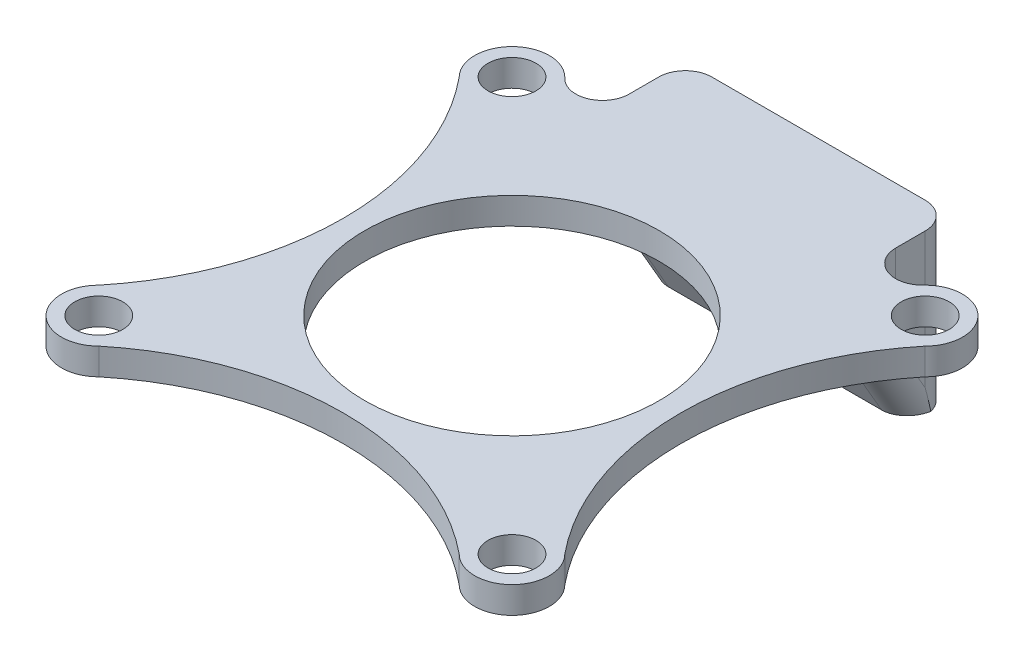
ISO-10303-21;
HEADER;
FILE_DESCRIPTION(('STEP AP214'),'2;1');
FILE_NAME('part.step','',(''),(''),'','','');
FILE_SCHEMA(('AUTOMOTIVE_DESIGN { 1 0 10303 214 1 1 1 1 }'));
ENDSEC;
DATA;
#1=APPLICATION_CONTEXT('core data for automotive mechanical design processes');
#2=APPLICATION_PROTOCOL_DEFINITION('international standard','automotive_design',2000,#1);
#3=PRODUCT_CONTEXT('',#1,'mechanical');
#4=PRODUCT('Part','Part','',(#3));
#5=PRODUCT_RELATED_PRODUCT_CATEGORY('part','',(#4));
#6=PRODUCT_DEFINITION_FORMATION('','',#4);
#7=PRODUCT_DEFINITION_CONTEXT('part definition',#1,'design');
#8=PRODUCT_DEFINITION('design','',#6,#7);
#9=PRODUCT_DEFINITION_SHAPE('','',#8);
#10=(LENGTH_UNIT() NAMED_UNIT(*) SI_UNIT(.MILLI.,.METRE.));
#11=(NAMED_UNIT(*) PLANE_ANGLE_UNIT() SI_UNIT($,.RADIAN.));
#12=(NAMED_UNIT(*) SI_UNIT($,.STERADIAN.) SOLID_ANGLE_UNIT());
#13=UNCERTAINTY_MEASURE_WITH_UNIT(LENGTH_MEASURE(1.E-05),#10,'distance_accuracy_value','');
#14=(GEOMETRIC_REPRESENTATION_CONTEXT(3) GLOBAL_UNCERTAINTY_ASSIGNED_CONTEXT((#13)) GLOBAL_UNIT_ASSIGNED_CONTEXT((#10,
#11,#12)) REPRESENTATION_CONTEXT('',''));
#15=CARTESIAN_POINT('',(0.,0.,0.));
#16=DIRECTION('',(0.,0.,1.));
#17=DIRECTION('',(1.,0.,0.));
#18=AXIS2_PLACEMENT_3D('',#15,#16,#17);
#19=CARTESIAN_POINT('',(0.,0.,0.));
#20=DIRECTION('',(0.,1.,0.));
#21=DIRECTION('',(0.,0.,1.));
#22=AXIS2_PLACEMENT_3D('',#19,#20,#21);
#23=PLANE('',#22);
#24=CARTESIAN_POINT('',(15.5,0.,-15.5));
#25=DIRECTION('',(0.,1.,0.));
#26=DIRECTION('',(0.,0.,1.));
#27=AXIS2_PLACEMENT_3D('',#24,#25,#26);
#28=CIRCLE('',#27,1.8);
#29=CARTESIAN_POINT('',(15.5,0.,-13.7));
#30=VERTEX_POINT('',#29);
#31=EDGE_CURVE('E221',#30,#30,#28,.T.);
#32=ORIENTED_EDGE('',*,*,#31,.T.);
#33=EDGE_LOOP('',(#32));
#34=FACE_BOUND('',#33,.T.);
#35=CARTESIAN_POINT('',(-15.5,0.,-15.5));
#36=DIRECTION('',(0.,1.,0.));
#37=DIRECTION('',(0.,0.,1.));
#38=AXIS2_PLACEMENT_3D('',#35,#36,#37);
#39=CIRCLE('',#38,1.8);
#40=CARTESIAN_POINT('',(-15.5,0.,-13.7));
#41=VERTEX_POINT('',#40);
#42=EDGE_CURVE('E305',#41,#41,#39,.T.);
#43=ORIENTED_EDGE('',*,*,#42,.T.);
#44=EDGE_LOOP('',(#43));
#45=FACE_BOUND('',#44,.T.);
#46=CARTESIAN_POINT('',(15.5,0.,15.5));
#47=DIRECTION('',(0.,1.,0.));
#48=DIRECTION('',(0.,0.,1.));
#49=AXIS2_PLACEMENT_3D('',#46,#47,#48);
#50=CIRCLE('',#49,1.8);
#51=CARTESIAN_POINT('',(15.5,0.,17.3));
#52=VERTEX_POINT('',#51);
#53=EDGE_CURVE('E302',#52,#52,#50,.T.);
#54=ORIENTED_EDGE('',*,*,#53,.T.);
#55=EDGE_LOOP('',(#54));
#56=FACE_BOUND('',#55,.T.);
#57=CARTESIAN_POINT('',(-15.5,0.,15.5));
#58=DIRECTION('',(0.,1.,0.));
#59=DIRECTION('',(0.,0.,1.));
#60=AXIS2_PLACEMENT_3D('',#57,#58,#59);
#61=CIRCLE('',#60,1.8);
#62=CARTESIAN_POINT('',(-15.5,0.,17.3));
#63=VERTEX_POINT('',#62);
#64=EDGE_CURVE('E299',#63,#63,#61,.T.);
#65=ORIENTED_EDGE('',*,*,#64,.T.);
#66=EDGE_LOOP('',(#65));
#67=FACE_BOUND('',#66,.T.);
#68=CARTESIAN_POINT('',(0.,0.,0.));
#69=DIRECTION('',(0.,1.,0.));
#70=DIRECTION('',(0.,0.,1.));
#71=AXIS2_PLACEMENT_3D('',#68,#69,#70);
#72=CIRCLE('',#71,11.05);
#73=CARTESIAN_POINT('',(0.,0.,11.05));
#74=VERTEX_POINT('',#73);
#75=EDGE_CURVE('E213',#74,#74,#72,.T.);
#76=ORIENTED_EDGE('',*,*,#75,.T.);
#77=EDGE_LOOP('',(#76));
#78=FACE_BOUND('',#77,.T.);
#79=DIRECTION('',(0.,0.,-1.));
#80=VECTOR('',#79,1.);
#81=CARTESIAN_POINT('',(-9.99999999999999,0.,0.));
#82=LINE('',#81,#80);
#83=CARTESIAN_POINT('',(-9.99999999999999,0.,-16.2691990514032));
#84=VERTEX_POINT('',#83);
#85=CARTESIAN_POINT('',(-9.99999999999999,0.,-18.7882250993909));
#86=VERTEX_POINT('',#85);
#87=EDGE_CURVE('E345',#84,#86,#82,.T.);
#88=ORIENTED_EDGE('',*,*,#87,.F.);
#89=CARTESIAN_POINT('',(-9.99999999999999,0.,-16.2691990514032));
#90=CARTESIAN_POINT('',(-10.0000118494146,0.,-16.1835037343897));
#91=CARTESIAN_POINT('',(-9.995871060249,0.,-16.0978584957627));
#92=CARTESIAN_POINT('',(-9.97985293954622,0.,-15.9274184610739));
#93=CARTESIAN_POINT('',(-9.96798738148554,0.,-15.8426225698818));
#94=CARTESIAN_POINT('',(-9.9372712269332,0.,-15.6753805815722));
#95=CARTESIAN_POINT('',(-9.91850649763211,0.,-15.5929184830836));
#96=CARTESIAN_POINT('',(-9.87456117093197,0.,-15.4296963884296));
#97=CARTESIAN_POINT('',(-9.84937750871959,0.,-15.3489372253551));
#98=CARTESIAN_POINT('',(-9.78275294574038,0.,-15.159829931352));
#99=CARTESIAN_POINT('',(-9.73874838783236,0.,-15.0523815928682));
#100=CARTESIAN_POINT('',(-9.64135428268142,0.,-14.8417902035389));
#101=CARTESIAN_POINT('',(-9.58795722921233,0.,-14.73865067838));
#102=CARTESIAN_POINT('',(-9.41546245238967,0.,-14.4350961040719));
#103=CARTESIAN_POINT('',(-9.28440934233648,0.,-14.241466056941));
#104=CARTESIAN_POINT('',(-8.97275976959645,0.,-13.8319811304066));
#105=CARTESIAN_POINT('',(-8.78752251951774,0.,-13.6198125874807));
#106=CARTESIAN_POINT('',(-8.4036415467613,0.,-13.2088808044606));
#107=CARTESIAN_POINT('',(-8.20500835209609,0.,-13.0101072771588));
#108=CARTESIAN_POINT('',(-8.00421636796887,0.,-12.8093138044099));
#109=CARTESIAN_POINT('',(-8.00210818282146,0.,-12.8072056192668));
#110=CARTESIAN_POINT('',(-7.99999999999999,0.,-12.8050974362655));
#111=B_SPLINE_CURVE_WITH_KNOTS('',3,(#89,#90,#91,#92,#93,#94,#95,#96,#97,#98,#99,#100,#101,#102,
#103,#104,#105,#106,#107,#108,#109,#110),.UNSPECIFIED.,.F.,.F.,(4,2,2,2,2,2,2,2,2,2,4),(0.,
0.256912595777849,0.513434539685123,0.766866291390348,1.02041927520561,1.36819331305815,
1.71624655574917,2.41527069662684,3.25887239086171,4.10181864660847,4.11076291851909),.UNSPECIFIED.);
#112=CARTESIAN_POINT('',(-7.99999999999999,0.,-12.8050974362655));
#113=VERTEX_POINT('',#112);
#114=EDGE_CURVE('E50',#84,#113,#111,.T.);
#115=ORIENTED_EDGE('',*,*,#114,.T.);
#116=DIRECTION('',(-1.,0.,0.));
#117=VECTOR('',#116,1.);
#118=CARTESIAN_POINT('',(0.,0.,-12.8050974362655));
#119=LINE('',#118,#117);
#120=CARTESIAN_POINT('',(8.00000000000001,0.,-12.8050974362655));
#121=VERTEX_POINT('',#120);
#122=EDGE_CURVE('E367',#113,#121,#119,.F.);
#123=ORIENTED_EDGE('',*,*,#122,.T.);
#124=CARTESIAN_POINT('',(10.,0.,-16.2691990514032));
#125=CARTESIAN_POINT('',(10.0000118494146,0.,-16.1835037343897));
#126=CARTESIAN_POINT('',(9.99587106024902,0.,-16.0978584957627));
#127=CARTESIAN_POINT('',(9.97985293954623,0.,-15.9274184610739));
#128=CARTESIAN_POINT('',(9.96798738148556,0.,-15.8426225698818));
#129=CARTESIAN_POINT('',(9.93727122693321,0.,-15.6753805815722));
#130=CARTESIAN_POINT('',(9.91850649763212,0.,-15.5929184830836));
#131=CARTESIAN_POINT('',(9.87456117093198,0.,-15.4296963884296));
#132=CARTESIAN_POINT('',(9.84937750871961,0.,-15.3489372253551));
#133=CARTESIAN_POINT('',(9.78275294574039,0.,-15.159829931352));
#134=CARTESIAN_POINT('',(9.73874838783237,0.,-15.0523815928682));
#135=CARTESIAN_POINT('',(9.64135428268143,0.,-14.8417902035389));
#136=CARTESIAN_POINT('',(9.58795722921235,0.,-14.73865067838));
#137=CARTESIAN_POINT('',(9.41546245238968,0.,-14.4350961040719));
#138=CARTESIAN_POINT('',(9.28440934233649,0.,-14.241466056941));
#139=CARTESIAN_POINT('',(8.97275976959646,0.,-13.8319811304066));
#140=CARTESIAN_POINT('',(8.78752251951775,0.,-13.6198125874807));
#141=CARTESIAN_POINT('',(8.40364154676131,0.,-13.2088808044606));
#142=CARTESIAN_POINT('',(8.20500835209611,0.,-13.0101072771588));
#143=CARTESIAN_POINT('',(8.00421636796889,0.,-12.8093138044099));
#144=CARTESIAN_POINT('',(8.00210818282148,0.,-12.8072056192668));
#145=CARTESIAN_POINT('',(8.00000000000001,0.,-12.8050974362655));
#146=B_SPLINE_CURVE_WITH_KNOTS('',3,(#124,#125,#126,#127,#128,#129,#130,#131,#132,#133,#134,
#135,#136,#137,#138,#139,#140,#141,#142,#143,#144,#145),.UNSPECIFIED.,.F.,.F.,(4,2,2,2,2,2,2,2,
2,2,4),(0.,0.256912595777849,0.513434539685123,0.766866291390348,1.02041927520561,
1.36819331305815,1.71624655574917,2.41527069662684,3.25887239086171,4.10181864660847,
4.11076291851909),.UNSPECIFIED.);
#147=CARTESIAN_POINT('',(10.,0.,-16.2691990514032));
#148=VERTEX_POINT('',#147);
#149=EDGE_CURVE('E11',#121,#148,#146,.F.);
#150=ORIENTED_EDGE('',*,*,#149,.T.);
#151=DIRECTION('',(0.,0.,1.));
#152=VECTOR('',#151,1.);
#153=CARTESIAN_POINT('',(10.,0.,0.));
#154=LINE('',#153,#152);
#155=CARTESIAN_POINT('',(10.,0.,-18.7882250993909));
#156=VERTEX_POINT('',#155);
#157=EDGE_CURVE('E333',#156,#148,#154,.T.);
#158=ORIENTED_EDGE('',*,*,#157,.F.);
#159=CARTESIAN_POINT('',(12.,0.,-18.7882250993909));
#160=DIRECTION('',(0.,1.,0.));
#161=DIRECTION('',(0.,0.,1.));
#162=AXIS2_PLACEMENT_3D('',#159,#160,#161);
#163=CIRCLE('',#162,2.);
#164=CARTESIAN_POINT('',(13.4142135623731,0.,-17.3740115370178));
#165=VERTEX_POINT('',#164);
#166=EDGE_CURVE('E347',#156,#165,#163,.T.);
#167=ORIENTED_EDGE('',*,*,#166,.T.);
#168=DIRECTION('',(-0.707106781186548,0.,0.707106781186548));
#169=VECTOR('',#168,1.);
#170=CARTESIAN_POINT('',(-1.97989898732233,0.,-1.97989898732233));
#171=LINE('',#170,#169);
#172=CARTESIAN_POINT('',(13.5201010126777,0.,-17.4798989873223));
#173=VERTEX_POINT('',#172);
#174=EDGE_CURVE('E285',#173,#165,#171,.T.);
#175=ORIENTED_EDGE('',*,*,#174,.F.);
#176=CARTESIAN_POINT('',(15.5,0.,-15.5));
#177=DIRECTION('',(0.,1.,0.));
#178=DIRECTION('',(0.,0.,1.));
#179=AXIS2_PLACEMENT_3D('',#176,#177,#178);
#180=CIRCLE('',#179,2.8);
#181=CARTESIAN_POINT('',(17.4798989873223,0.,-13.5201010126777));
#182=VERTEX_POINT('',#181);
#183=EDGE_CURVE('E282',#173,#182,#180,.F.);
#184=ORIENTED_EDGE('',*,*,#183,.T.);
#185=CARTESIAN_POINT('',(33.988029652564,0.,0.));
#186=DIRECTION('',(0.,1.,0.));
#187=DIRECTION('',(0.,0.,1.));
#188=AXIS2_PLACEMENT_3D('',#185,#186,#187);
#189=CIRCLE('',#188,21.338029652564);
#190=CARTESIAN_POINT('',(17.4798989873223,0.,13.5201010126777));
#191=VERTEX_POINT('',#190);
#192=EDGE_CURVE('E279',#182,#191,#189,.T.);
#193=ORIENTED_EDGE('',*,*,#192,.T.);
#194=CARTESIAN_POINT('',(15.5,0.,15.5));
#195=DIRECTION('',(0.,1.,0.));
#196=DIRECTION('',(0.,0.,1.));
#197=AXIS2_PLACEMENT_3D('',#194,#195,#196);
#198=CIRCLE('',#197,2.8);
#199=CARTESIAN_POINT('',(13.5201010126777,0.,17.4798989873223));
#200=VERTEX_POINT('',#199);
#201=EDGE_CURVE('E276',#191,#200,#198,.F.);
#202=ORIENTED_EDGE('',*,*,#201,.T.);
#203=CARTESIAN_POINT('',(0.,0.,33.9880296525639));
#204=DIRECTION('',(0.,1.,0.));
#205=DIRECTION('',(0.,0.,1.));
#206=AXIS2_PLACEMENT_3D('',#203,#204,#205);
#207=CIRCLE('',#206,21.3380296525639);
#208=CARTESIAN_POINT('',(-13.5201010126777,0.,17.4798989873223));
#209=VERTEX_POINT('',#208);
#210=EDGE_CURVE('E273',#200,#209,#207,.T.);
#211=ORIENTED_EDGE('',*,*,#210,.T.);
#212=CARTESIAN_POINT('',(-15.5,0.,15.5));
#213=DIRECTION('',(0.,1.,0.));
#214=DIRECTION('',(0.,0.,1.));
#215=AXIS2_PLACEMENT_3D('',#212,#213,#214);
#216=CIRCLE('',#215,2.8);
#217=CARTESIAN_POINT('',(-17.4798989873223,0.,13.5201010126777));
#218=VERTEX_POINT('',#217);
#219=EDGE_CURVE('E296',#218,#209,#216,.T.);
#220=ORIENTED_EDGE('',*,*,#219,.F.);
#221=CARTESIAN_POINT('',(-33.988029652564,0.,0.));
#222=DIRECTION('',(0.,1.,0.));
#223=DIRECTION('',(0.,0.,1.));
#224=AXIS2_PLACEMENT_3D('',#221,#222,#223);
#225=CIRCLE('',#224,21.338029652564);
#226=CARTESIAN_POINT('',(-17.4798989873223,0.,-13.5201010126777));
#227=VERTEX_POINT('',#226);
#228=EDGE_CURVE('E293',#227,#218,#225,.F.);
#229=ORIENTED_EDGE('',*,*,#228,.F.);
#230=CARTESIAN_POINT('',(-15.5,0.,-15.5));
#231=DIRECTION('',(0.,1.,0.));
#232=DIRECTION('',(0.,0.,1.));
#233=AXIS2_PLACEMENT_3D('',#230,#231,#232);
#234=CIRCLE('',#233,2.8);
#235=CARTESIAN_POINT('',(-13.5201010126776,0.,-17.4798989873223));
#236=VERTEX_POINT('',#235);
#237=EDGE_CURVE('E290',#236,#227,#234,.T.);
#238=ORIENTED_EDGE('',*,*,#237,.F.);
#239=DIRECTION('',(-0.707106781186547,0.,-0.707106781186548));
#240=VECTOR('',#239,1.);
#241=CARTESIAN_POINT('',(1.97989898732234,0.,-1.97989898732233));
#242=LINE('',#241,#240);
#243=CARTESIAN_POINT('',(-13.4142135623731,0.,-17.3740115370178));
#244=VERTEX_POINT('',#243);
#245=EDGE_CURVE('E288',#244,#236,#242,.T.);
#246=ORIENTED_EDGE('',*,*,#245,.F.);
#247=CARTESIAN_POINT('',(-12.,0.,-18.7882250993909));
#248=DIRECTION('',(0.,1.,0.));
#249=DIRECTION('',(0.,0.,1.));
#250=AXIS2_PLACEMENT_3D('',#247,#248,#249);
#251=CIRCLE('',#250,2.);
#252=EDGE_CURVE('E351',#244,#86,#251,.T.);
#253=ORIENTED_EDGE('',*,*,#252,.T.);
#254=EDGE_LOOP('',(#88,#115,#123,#150,#158,#167,#175,#184,#193,#202,#211,#220,#229,#238,#246,#253));
#255=FACE_BOUND('',#254,.T.);
#256=ADVANCED_FACE('F41',(#34,#45,#56,#67,#78,#255),#23,.F.);
#257=CARTESIAN_POINT('',(0.,2.,33.9880296525639));
#258=DIRECTION('',(0.,-1.,0.));
#259=DIRECTION('',(0.,0.,-1.));
#260=AXIS2_PLACEMENT_3D('',#257,#258,#259);
#261=CYLINDRICAL_SURFACE('',#260,21.3380296525639);
#262=ORIENTED_EDGE('',*,*,#210,.F.);
#263=DIRECTION('',(0.,-1.,0.));
#264=VECTOR('',#263,1.);
#265=CARTESIAN_POINT('',(13.5201010126777,2.,17.4798989873223));
#266=LINE('',#265,#264);
#267=CARTESIAN_POINT('',(13.5201010126777,2.,17.4798989873223));
#268=VERTEX_POINT('',#267);
#269=EDGE_CURVE('E331',#268,#200,#266,.T.);
#270=ORIENTED_EDGE('',*,*,#269,.F.);
#271=CARTESIAN_POINT('',(0.,2.,33.9880296525639));
#272=DIRECTION('',(0.,1.,0.));
#273=DIRECTION('',(0.,0.,1.));
#274=AXIS2_PLACEMENT_3D('',#271,#272,#273);
#275=CIRCLE('',#274,21.3380296525639);
#276=CARTESIAN_POINT('',(-13.5201010126777,2.,17.4798989873223));
#277=VERTEX_POINT('',#276);
#278=EDGE_CURVE('E220',#268,#277,#275,.T.);
#279=ORIENTED_EDGE('',*,*,#278,.T.);
#280=DIRECTION('',(0.,-1.,0.));
#281=VECTOR('',#280,1.);
#282=CARTESIAN_POINT('',(-13.5201010126777,2.,17.4798989873223));
#283=LINE('',#282,#281);
#284=EDGE_CURVE('E270',#277,#209,#283,.T.);
#285=ORIENTED_EDGE('',*,*,#284,.T.);
#286=EDGE_LOOP('',(#262,#270,#279,#285));
#287=FACE_BOUND('',#286,.T.);
#288=ADVANCED_FACE('F422',(#287),#261,.F.);
#289=CARTESIAN_POINT('',(15.5,2.,15.5));
#290=DIRECTION('',(0.,-1.,0.));
#291=DIRECTION('',(0.,0.,-1.));
#292=AXIS2_PLACEMENT_3D('',#289,#290,#291);
#293=CYLINDRICAL_SURFACE('',#292,2.8);
#294=ORIENTED_EDGE('',*,*,#201,.F.);
#295=DIRECTION('',(0.,-1.,0.));
#296=VECTOR('',#295,1.);
#297=CARTESIAN_POINT('',(17.4798989873223,2.,13.5201010126777));
#298=LINE('',#297,#296);
#299=CARTESIAN_POINT('',(17.4798989873223,2.,13.5201010126777));
#300=VERTEX_POINT('',#299);
#301=EDGE_CURVE('E329',#300,#191,#298,.T.);
#302=ORIENTED_EDGE('',*,*,#301,.F.);
#303=CARTESIAN_POINT('',(15.5,2.,15.5));
#304=DIRECTION('',(0.,1.,0.));
#305=DIRECTION('',(0.,0.,1.));
#306=AXIS2_PLACEMENT_3D('',#303,#304,#305);
#307=CIRCLE('',#306,2.8);
#308=EDGE_CURVE('E224',#300,#268,#307,.F.);
#309=ORIENTED_EDGE('',*,*,#308,.T.);
#310=ORIENTED_EDGE('',*,*,#269,.T.);
#311=EDGE_LOOP('',(#294,#302,#309,#310));
#312=FACE_BOUND('',#311,.T.);
#313=ADVANCED_FACE('F427',(#312),#293,.T.);
#314=CARTESIAN_POINT('',(33.988029652564,2.,0.));
#315=DIRECTION('',(0.,-1.,0.));
#316=DIRECTION('',(0.,0.,-1.));
#317=AXIS2_PLACEMENT_3D('',#314,#315,#316);
#318=CYLINDRICAL_SURFACE('',#317,21.338029652564);
#319=ORIENTED_EDGE('',*,*,#192,.F.);
#320=DIRECTION('',(0.,-1.,0.));
#321=VECTOR('',#320,1.);
#322=CARTESIAN_POINT('',(17.4798989873223,2.,-13.5201010126777));
#323=LINE('',#322,#321);
#324=CARTESIAN_POINT('',(17.4798989873223,2.,-13.5201010126777));
#325=VERTEX_POINT('',#324);
#326=EDGE_CURVE('E327',#325,#182,#323,.T.);
#327=ORIENTED_EDGE('',*,*,#326,.F.);
#328=CARTESIAN_POINT('',(33.988029652564,2.,0.));
#329=DIRECTION('',(0.,1.,0.));
#330=DIRECTION('',(0.,0.,1.));
#331=AXIS2_PLACEMENT_3D('',#328,#329,#330);
#332=CIRCLE('',#331,21.338029652564);
#333=EDGE_CURVE('E227',#325,#300,#332,.T.);
#334=ORIENTED_EDGE('',*,*,#333,.T.);
#335=ORIENTED_EDGE('',*,*,#301,.T.);
#336=EDGE_LOOP('',(#319,#327,#334,#335));
#337=FACE_BOUND('',#336,.T.);
#338=ADVANCED_FACE('F491',(#337),#318,.F.);
#339=CARTESIAN_POINT('',(15.5,2.,-15.5));
#340=DIRECTION('',(0.,-1.,0.));
#341=DIRECTION('',(0.,0.,-1.));
#342=AXIS2_PLACEMENT_3D('',#339,#340,#341);
#343=CYLINDRICAL_SURFACE('',#342,2.8);
#344=ORIENTED_EDGE('',*,*,#183,.F.);
#345=DIRECTION('',(0.,-1.,0.));
#346=VECTOR('',#345,1.);
#347=CARTESIAN_POINT('',(13.5201010126777,2.,-17.4798989873223));
#348=LINE('',#347,#346);
#349=CARTESIAN_POINT('',(13.5201010126777,2.,-17.4798989873223));
#350=VERTEX_POINT('',#349);
#351=EDGE_CURVE('E325',#350,#173,#348,.T.);
#352=ORIENTED_EDGE('',*,*,#351,.F.);
#353=CARTESIAN_POINT('',(15.5,2.,-15.5));
#354=DIRECTION('',(0.,1.,0.));
#355=DIRECTION('',(0.,0.,1.));
#356=AXIS2_PLACEMENT_3D('',#353,#354,#355);
#357=CIRCLE('',#356,2.8);
#358=EDGE_CURVE('E230',#350,#325,#357,.F.);
#359=ORIENTED_EDGE('',*,*,#358,.T.);
#360=ORIENTED_EDGE('',*,*,#326,.T.);
#361=EDGE_LOOP('',(#344,#352,#359,#360));
#362=FACE_BOUND('',#361,.T.);
#363=ADVANCED_FACE('F487',(#362),#343,.T.);
#364=CARTESIAN_POINT('',(-1.97989898732233,2.,-1.97989898732233));
#365=DIRECTION('',(0.707106781186547,0.,0.707106781186547));
#366=DIRECTION('',(0.707106781186548,0.,-0.707106781186548));
#367=AXIS2_PLACEMENT_3D('',#364,#365,#366);
#368=PLANE('',#367);
#369=ORIENTED_EDGE('',*,*,#174,.T.);
#370=DIRECTION('',(0.,-1.,0.));
#371=VECTOR('',#370,1.);
#372=CARTESIAN_POINT('',(13.4142135623731,2.,-17.3740115370178));
#373=LINE('',#372,#371);
#374=CARTESIAN_POINT('',(13.4142135623731,2.,-17.3740115370178));
#375=VERTEX_POINT('',#374);
#376=EDGE_CURVE('E338',#165,#375,#373,.F.);
#377=ORIENTED_EDGE('',*,*,#376,.T.);
#378=DIRECTION('',(-0.707106781186548,0.,0.707106781186548));
#379=VECTOR('',#378,1.);
#380=CARTESIAN_POINT('',(-1.97989898732233,2.,-1.97989898732233));
#381=LINE('',#380,#379);
#382=EDGE_CURVE('E233',#350,#375,#381,.T.);
#383=ORIENTED_EDGE('',*,*,#382,.F.);
#384=ORIENTED_EDGE('',*,*,#351,.T.);
#385=EDGE_LOOP('',(#369,#377,#383,#384));
#386=FACE_BOUND('',#385,.T.);
#387=ADVANCED_FACE('F483',(#386),#368,.F.);
#388=CARTESIAN_POINT('',(10.,2.,0.));
#389=DIRECTION('',(1.,0.,0.));
#390=DIRECTION('',(0.,0.,-1.));
#391=AXIS2_PLACEMENT_3D('',#388,#389,#390);
#392=PLANE('',#391);
#393=ORIENTED_EDGE('',*,*,#157,.T.);
#394=DIRECTION('',(0.,-0.86602540378444,-0.499999999999998));
#395=VECTOR('',#394,1.);
#396=CARTESIAN_POINT('',(10.,8.54476983887042,-11.335873884768));
#397=LINE('',#396,#395);
#398=CARTESIAN_POINT('',(10.,-8.19398760346472,-21.));
#399=VERTEX_POINT('',#398);
#400=EDGE_CURVE('E58',#148,#399,#397,.T.);
#401=ORIENTED_EDGE('',*,*,#400,.T.);
#402=DIRECTION('',(0.,-1.,0.));
#403=VECTOR('',#402,1.);
#404=CARTESIAN_POINT('',(10.,2.,-21.));
#405=LINE('',#404,#403);
#406=CARTESIAN_POINT('',(10.,2.,-21.));
#407=VERTEX_POINT('',#406);
#408=EDGE_CURVE('E323',#407,#399,#405,.T.);
#409=ORIENTED_EDGE('',*,*,#408,.F.);
#410=DIRECTION('',(0.,0.,1.));
#411=VECTOR('',#410,1.);
#412=CARTESIAN_POINT('',(10.,2.,0.));
#413=LINE('',#412,#411);
#414=CARTESIAN_POINT('',(10.,2.,-18.7882250993909));
#415=VERTEX_POINT('',#414);
#416=EDGE_CURVE('E236',#407,#415,#413,.T.);
#417=ORIENTED_EDGE('',*,*,#416,.T.);
#418=DIRECTION('',(0.,-1.,0.));
#419=VECTOR('',#418,1.);
#420=CARTESIAN_POINT('',(10.,2.,-18.7882250993909));
#421=LINE('',#420,#419);
#422=EDGE_CURVE('E335',#415,#156,#421,.T.);
#423=ORIENTED_EDGE('',*,*,#422,.T.);
#424=EDGE_LOOP('',(#393,#401,#409,#417,#423));
#425=FACE_BOUND('',#424,.T.);
#426=ADVANCED_FACE('F476',(#425),#392,.T.);
#427=CARTESIAN_POINT('',(8.00000000000001,2.,-21.));
#428=DIRECTION('',(0.,-1.,0.));
#429=DIRECTION('',(0.,0.,-1.));
#430=AXIS2_PLACEMENT_3D('',#427,#428,#429);
#431=CYLINDRICAL_SURFACE('',#430,2.);
#432=ORIENTED_EDGE('',*,*,#408,.T.);
#433=CARTESIAN_POINT('',(8.00000000000001,-8.19398760346472,-21.));
#434=DIRECTION('',(0.,-0.25881904510252,0.965925826289069));
#435=DIRECTION('',(0.,-0.965925826289069,-0.25881904510252));
#436=AXIS2_PLACEMENT_3D('',#433,#434,#435);
#437=ELLIPSE('',#436,7.72740661031259,2.);
#438=CARTESIAN_POINT('',(9.94057255890607,-10.,-21.4839195631722));
#439=VERTEX_POINT('',#438);
#440=EDGE_CURVE('E387',#399,#439,#437,.F.);
#441=ORIENTED_EDGE('',*,*,#440,.T.);
#442=CARTESIAN_POINT('',(8.00000000000001,-10.,-21.));
#443=DIRECTION('',(0.,-1.,0.));
#444=DIRECTION('',(0.,0.,-1.));
#445=AXIS2_PLACEMENT_3D('',#442,#443,#444);
#446=CIRCLE('',#445,2.);
#447=CARTESIAN_POINT('',(8.00000000000001,-10.,-23.));
#448=VERTEX_POINT('',#447);
#449=EDGE_CURVE('E211',#448,#439,#446,.T.);
#450=ORIENTED_EDGE('',*,*,#449,.F.);
#451=DIRECTION('',(0.,-1.,0.));
#452=VECTOR('',#451,1.);
#453=CARTESIAN_POINT('',(8.00000000000001,2.,-23.));
#454=LINE('',#453,#452);
#455=CARTESIAN_POINT('',(8.00000000000001,2.,-23.));
#456=VERTEX_POINT('',#455);
#457=EDGE_CURVE('E207',#456,#448,#454,.T.);
#458=ORIENTED_EDGE('',*,*,#457,.F.);
#459=CARTESIAN_POINT('',(8.00000000000001,2.,-21.));
#460=DIRECTION('',(0.,1.,0.));
#461=DIRECTION('',(0.,0.,1.));
#462=AXIS2_PLACEMENT_3D('',#459,#460,#461);
#463=CIRCLE('',#462,2.);
#464=EDGE_CURVE('E239',#456,#407,#463,.F.);
#465=ORIENTED_EDGE('',*,*,#464,.T.);
#466=EDGE_LOOP('',(#432,#441,#450,#458,#465));
#467=FACE_BOUND('',#466,.T.);
#468=ADVANCED_FACE('F464',(#467),#431,.T.);
#469=CARTESIAN_POINT('',(0.,2.,-23.));
#470=DIRECTION('',(0.,0.,-1.));
#471=DIRECTION('',(-1.,0.,0.));
#472=AXIS2_PLACEMENT_3D('',#469,#470,#471);
#473=PLANE('',#472);
#474=CARTESIAN_POINT('',(-4.75,-5.,-23.));
#475=DIRECTION('',(0.,0.,-1.));
#476=DIRECTION('',(-1.,0.,0.));
#477=AXIS2_PLACEMENT_3D('',#474,#475,#476);
#478=CIRCLE('',#477,0.75);
#479=CARTESIAN_POINT('',(-5.5,-5.,-23.));
#480=VERTEX_POINT('',#479);
#481=EDGE_CURVE('E364',#480,#480,#478,.T.);
#482=ORIENTED_EDGE('',*,*,#481,.F.);
#483=EDGE_LOOP('',(#482));
#484=FACE_BOUND('',#483,.T.);
#485=CARTESIAN_POINT('',(4.75,-5.,-23.));
#486=DIRECTION('',(0.,0.,-1.));
#487=DIRECTION('',(-1.,0.,0.));
#488=AXIS2_PLACEMENT_3D('',#485,#486,#487);
#489=CIRCLE('',#488,0.75);
#490=CARTESIAN_POINT('',(4.,-5.,-23.));
#491=VERTEX_POINT('',#490);
#492=EDGE_CURVE('E450',#491,#491,#489,.T.);
#493=ORIENTED_EDGE('',*,*,#492,.F.);
#494=EDGE_LOOP('',(#493));
#495=FACE_BOUND('',#494,.T.);
#496=ORIENTED_EDGE('',*,*,#457,.T.);
#497=DIRECTION('',(1.,0.,0.));
#498=VECTOR('',#497,1.);
#499=CARTESIAN_POINT('',(0.,-10.,-23.));
#500=LINE('',#499,#498);
#501=CARTESIAN_POINT('',(-7.99999999999999,-10.,-23.));
#502=VERTEX_POINT('',#501);
#503=EDGE_CURVE('E191',#502,#448,#500,.T.);
#504=ORIENTED_EDGE('',*,*,#503,.F.);
#505=DIRECTION('',(0.,-1.,0.));
#506=VECTOR('',#505,1.);
#507=CARTESIAN_POINT('',(-7.99999999999999,2.,-23.));
#508=LINE('',#507,#506);
#509=CARTESIAN_POINT('',(-7.99999999999999,2.,-23.));
#510=VERTEX_POINT('',#509);
#511=EDGE_CURVE('E200',#510,#502,#508,.T.);
#512=ORIENTED_EDGE('',*,*,#511,.F.);
#513=DIRECTION('',(1.,0.,0.));
#514=VECTOR('',#513,1.);
#515=CARTESIAN_POINT('',(0.,2.,-23.));
#516=LINE('',#515,#514);
#517=EDGE_CURVE('E242',#510,#456,#516,.T.);
#518=ORIENTED_EDGE('',*,*,#517,.T.);
#519=EDGE_LOOP('',(#496,#504,#512,#518));
#520=FACE_BOUND('',#519,.T.);
#521=ADVANCED_FACE('F210',(#484,#495,#520),#473,.T.);
#522=CARTESIAN_POINT('',(-7.99999999999999,2.,-21.));
#523=DIRECTION('',(0.,-1.,0.));
#524=DIRECTION('',(0.,0.,-1.));
#525=AXIS2_PLACEMENT_3D('',#522,#523,#524);
#526=CYLINDRICAL_SURFACE('',#525,2.);
#527=CARTESIAN_POINT('',(-7.99999999999999,-10.,-21.));
#528=DIRECTION('',(0.,-1.,0.));
#529=DIRECTION('',(0.,0.,-1.));
#530=AXIS2_PLACEMENT_3D('',#527,#528,#529);
#531=CIRCLE('',#530,2.);
#532=CARTESIAN_POINT('',(-9.94057255890605,-10.,-21.4839195631722));
#533=VERTEX_POINT('',#532);
#534=EDGE_CURVE('E185',#533,#502,#531,.T.);
#535=ORIENTED_EDGE('',*,*,#534,.F.);
#536=CARTESIAN_POINT('',(-7.99999999999999,-8.19398760346472,-21.));
#537=DIRECTION('',(0.,-0.25881904510252,0.965925826289069));
#538=DIRECTION('',(0.,-0.965925826289069,-0.25881904510252));
#539=AXIS2_PLACEMENT_3D('',#536,#537,#538);
#540=ELLIPSE('',#539,7.72740661031259,2.);
#541=CARTESIAN_POINT('',(-9.99999999999999,-8.19398760346472,-21.));
#542=VERTEX_POINT('',#541);
#543=EDGE_CURVE('E384',#533,#542,#540,.F.);
#544=ORIENTED_EDGE('',*,*,#543,.T.);
#545=DIRECTION('',(0.,-1.,0.));
#546=VECTOR('',#545,1.);
#547=CARTESIAN_POINT('',(-9.99999999999999,2.,-21.));
#548=LINE('',#547,#546);
#549=CARTESIAN_POINT('',(-9.99999999999999,2.,-21.));
#550=VERTEX_POINT('',#549);
#551=EDGE_CURVE('E208',#550,#542,#548,.T.);
#552=ORIENTED_EDGE('',*,*,#551,.F.);
#553=CARTESIAN_POINT('',(-7.99999999999999,2.,-21.));
#554=DIRECTION('',(0.,1.,0.));
#555=DIRECTION('',(0.,0.,1.));
#556=AXIS2_PLACEMENT_3D('',#553,#554,#555);
#557=CIRCLE('',#556,2.);
#558=EDGE_CURVE('E203',#550,#510,#557,.F.);
#559=ORIENTED_EDGE('',*,*,#558,.T.);
#560=ORIENTED_EDGE('',*,*,#511,.T.);
#561=EDGE_LOOP('',(#535,#544,#552,#559,#560));
#562=FACE_BOUND('',#561,.T.);
#563=ADVANCED_FACE('F201',(#562),#526,.T.);
#564=CARTESIAN_POINT('',(-9.99999999999999,2.,0.));
#565=DIRECTION('',(1.,0.,0.));
#566=DIRECTION('',(0.,0.,-1.));
#567=AXIS2_PLACEMENT_3D('',#564,#565,#566);
#568=PLANE('',#567);
#569=ORIENTED_EDGE('',*,*,#551,.T.);
#570=DIRECTION('',(0.,0.86602540378444,0.499999999999998));
#571=VECTOR('',#570,1.);
#572=CARTESIAN_POINT('',(-9.99999999999999,0.,-16.2691990514032));
#573=LINE('',#572,#571);
#574=EDGE_CURVE('E375',#542,#84,#573,.T.);
#575=ORIENTED_EDGE('',*,*,#574,.T.);
#576=ORIENTED_EDGE('',*,*,#87,.T.);
#577=DIRECTION('',(0.,-1.,0.));
#578=VECTOR('',#577,1.);
#579=CARTESIAN_POINT('',(-9.99999999999999,2.,-18.7882250993909));
#580=LINE('',#579,#578);
#581=CARTESIAN_POINT('',(-9.99999999999999,2.,-18.7882250993909));
#582=VERTEX_POINT('',#581);
#583=EDGE_CURVE('E343',#86,#582,#580,.F.);
#584=ORIENTED_EDGE('',*,*,#583,.T.);
#585=DIRECTION('',(0.,0.,1.));
#586=VECTOR('',#585,1.);
#587=CARTESIAN_POINT('',(-9.99999999999999,2.,0.));
#588=LINE('',#587,#586);
#589=EDGE_CURVE('E245',#550,#582,#588,.T.);
#590=ORIENTED_EDGE('',*,*,#589,.F.);
#591=EDGE_LOOP('',(#569,#575,#576,#584,#590));
#592=FACE_BOUND('',#591,.T.);
#593=ADVANCED_FACE('F466',(#592),#568,.F.);
#594=CARTESIAN_POINT('',(1.97989898732234,2.,-1.97989898732233));
#595=DIRECTION('',(-0.707106781186548,0.,0.707106781186547));
#596=DIRECTION('',(0.707106781186547,0.,0.707106781186548));
#597=AXIS2_PLACEMENT_3D('',#594,#595,#596);
#598=PLANE('',#597);
#599=DIRECTION('',(-0.707106781186547,0.,-0.707106781186548));
#600=VECTOR('',#599,1.);
#601=CARTESIAN_POINT('',(1.97989898732234,2.,-1.97989898732233));
#602=LINE('',#601,#600);
#603=CARTESIAN_POINT('',(-13.4142135623731,2.,-17.3740115370178));
#604=VERTEX_POINT('',#603);
#605=CARTESIAN_POINT('',(-13.5201010126776,2.,-17.4798989873223));
#606=VERTEX_POINT('',#605);
#607=EDGE_CURVE('E248',#604,#606,#602,.T.);
#608=ORIENTED_EDGE('',*,*,#607,.F.);
#609=DIRECTION('',(0.,-1.,0.));
#610=VECTOR('',#609,1.);
#611=CARTESIAN_POINT('',(-13.4142135623731,0.,-17.3740115370178));
#612=LINE('',#611,#610);
#613=EDGE_CURVE('E340',#604,#244,#612,.T.);
#614=ORIENTED_EDGE('',*,*,#613,.T.);
#615=ORIENTED_EDGE('',*,*,#245,.T.);
#616=DIRECTION('',(0.,-1.,0.));
#617=VECTOR('',#616,1.);
#618=CARTESIAN_POINT('',(-13.5201010126776,2.,-17.4798989873223));
#619=LINE('',#618,#617);
#620=EDGE_CURVE('E317',#606,#236,#619,.T.);
#621=ORIENTED_EDGE('',*,*,#620,.F.);
#622=EDGE_LOOP('',(#608,#614,#615,#621));
#623=FACE_BOUND('',#622,.T.);
#624=ADVANCED_FACE('F510',(#623),#598,.F.);
#625=CARTESIAN_POINT('',(-15.5,2.,-15.5));
#626=DIRECTION('',(0.,-1.,0.));
#627=DIRECTION('',(0.,0.,-1.));
#628=AXIS2_PLACEMENT_3D('',#625,#626,#627);
#629=CYLINDRICAL_SURFACE('',#628,2.8);
#630=ORIENTED_EDGE('',*,*,#237,.T.);
#631=DIRECTION('',(0.,-1.,0.));
#632=VECTOR('',#631,1.);
#633=CARTESIAN_POINT('',(-17.4798989873223,2.,-13.5201010126777));
#634=LINE('',#633,#632);
#635=CARTESIAN_POINT('',(-17.4798989873223,2.,-13.5201010126777));
#636=VERTEX_POINT('',#635);
#637=EDGE_CURVE('E314',#636,#227,#634,.T.);
#638=ORIENTED_EDGE('',*,*,#637,.F.);
#639=CARTESIAN_POINT('',(-15.5,2.,-15.5));
#640=DIRECTION('',(0.,1.,0.));
#641=DIRECTION('',(0.,0.,1.));
#642=AXIS2_PLACEMENT_3D('',#639,#640,#641);
#643=CIRCLE('',#642,2.8);
#644=EDGE_CURVE('E250',#606,#636,#643,.T.);
#645=ORIENTED_EDGE('',*,*,#644,.F.);
#646=ORIENTED_EDGE('',*,*,#620,.T.);
#647=EDGE_LOOP('',(#630,#638,#645,#646));
#648=FACE_BOUND('',#647,.T.);
#649=ADVANCED_FACE('F506',(#648),#629,.T.);
#650=CARTESIAN_POINT('',(-33.988029652564,2.,0.));
#651=DIRECTION('',(0.,-1.,0.));
#652=DIRECTION('',(0.,0.,-1.));
#653=AXIS2_PLACEMENT_3D('',#650,#651,#652);
#654=CYLINDRICAL_SURFACE('',#653,21.338029652564);
#655=ORIENTED_EDGE('',*,*,#228,.T.);
#656=DIRECTION('',(0.,-1.,0.));
#657=VECTOR('',#656,1.);
#658=CARTESIAN_POINT('',(-17.4798989873223,2.,13.5201010126777));
#659=LINE('',#658,#657);
#660=CARTESIAN_POINT('',(-17.4798989873223,2.,13.5201010126777));
#661=VERTEX_POINT('',#660);
#662=EDGE_CURVE('E311',#661,#218,#659,.T.);
#663=ORIENTED_EDGE('',*,*,#662,.F.);
#664=CARTESIAN_POINT('',(-33.988029652564,2.,0.));
#665=DIRECTION('',(0.,1.,0.));
#666=DIRECTION('',(0.,0.,1.));
#667=AXIS2_PLACEMENT_3D('',#664,#665,#666);
#668=CIRCLE('',#667,21.338029652564);
#669=EDGE_CURVE('E253',#636,#661,#668,.F.);
#670=ORIENTED_EDGE('',*,*,#669,.F.);
#671=ORIENTED_EDGE('',*,*,#637,.T.);
#672=EDGE_LOOP('',(#655,#663,#670,#671));
#673=FACE_BOUND('',#672,.T.);
#674=ADVANCED_FACE('F502',(#673),#654,.F.);
#675=CARTESIAN_POINT('',(-15.5,2.,-15.5));
#676=DIRECTION('',(0.,-1.,0.));
#677=DIRECTION('',(0.,0.,-1.));
#678=AXIS2_PLACEMENT_3D('',#675,#676,#677);
#679=CYLINDRICAL_SURFACE('',#678,1.8);
#680=CARTESIAN_POINT('',(-15.5,2.,-15.5));
#681=DIRECTION('',(0.,1.,0.));
#682=DIRECTION('',(0.,0.,1.));
#683=AXIS2_PLACEMENT_3D('',#680,#681,#682);
#684=CIRCLE('',#683,1.8);
#685=CARTESIAN_POINT('',(-15.5,2.,-13.7));
#686=VERTEX_POINT('',#685);
#687=EDGE_CURVE('E264',#686,#686,#684,.T.);
#688=ORIENTED_EDGE('',*,*,#687,.T.);
#689=EDGE_LOOP('',(#688));
#690=FACE_BOUND('',#689,.T.);
#691=ORIENTED_EDGE('',*,*,#42,.F.);
#692=EDGE_LOOP('',(#691));
#693=FACE_BOUND('',#692,.T.);
#694=ADVANCED_FACE('F556',(#690,#693),#679,.F.);
#695=CARTESIAN_POINT('',(15.5,2.,15.5));
#696=DIRECTION('',(0.,-1.,0.));
#697=DIRECTION('',(0.,0.,-1.));
#698=AXIS2_PLACEMENT_3D('',#695,#696,#697);
#699=CYLINDRICAL_SURFACE('',#698,1.8);
#700=CARTESIAN_POINT('',(15.5,2.,15.5));
#701=DIRECTION('',(0.,1.,0.));
#702=DIRECTION('',(0.,0.,1.));
#703=AXIS2_PLACEMENT_3D('',#700,#701,#702);
#704=CIRCLE('',#703,1.8);
#705=CARTESIAN_POINT('',(15.5,2.,17.3));
#706=VERTEX_POINT('',#705);
#707=EDGE_CURVE('E261',#706,#706,#704,.T.);
#708=ORIENTED_EDGE('',*,*,#707,.T.);
#709=EDGE_LOOP('',(#708));
#710=FACE_BOUND('',#709,.T.);
#711=ORIENTED_EDGE('',*,*,#53,.F.);
#712=EDGE_LOOP('',(#711));
#713=FACE_BOUND('',#712,.T.);
#714=ADVANCED_FACE('F562',(#710,#713),#699,.F.);
#715=CARTESIAN_POINT('',(-15.5,2.,15.5));
#716=DIRECTION('',(0.,-1.,0.));
#717=DIRECTION('',(0.,0.,-1.));
#718=AXIS2_PLACEMENT_3D('',#715,#716,#717);
#719=CYLINDRICAL_SURFACE('',#718,1.8);
#720=CARTESIAN_POINT('',(-15.5,2.,15.5));
#721=DIRECTION('',(0.,1.,0.));
#722=DIRECTION('',(0.,0.,1.));
#723=AXIS2_PLACEMENT_3D('',#720,#721,#722);
#724=CIRCLE('',#723,1.8);
#725=CARTESIAN_POINT('',(-15.5,2.,17.3));
#726=VERTEX_POINT('',#725);
#727=EDGE_CURVE('E258',#726,#726,#724,.T.);
#728=ORIENTED_EDGE('',*,*,#727,.T.);
#729=EDGE_LOOP('',(#728));
#730=FACE_BOUND('',#729,.T.);
#731=ORIENTED_EDGE('',*,*,#64,.F.);
#732=EDGE_LOOP('',(#731));
#733=FACE_BOUND('',#732,.T.);
#734=ADVANCED_FACE('F559',(#730,#733),#719,.F.);
#735=CARTESIAN_POINT('',(-15.5,2.,15.5));
#736=DIRECTION('',(0.,-1.,0.));
#737=DIRECTION('',(0.,0.,-1.));
#738=AXIS2_PLACEMENT_3D('',#735,#736,#737);
#739=CYLINDRICAL_SURFACE('',#738,2.8);
#740=ORIENTED_EDGE('',*,*,#219,.T.);
#741=ORIENTED_EDGE('',*,*,#284,.F.);
#742=CARTESIAN_POINT('',(-15.5,2.,15.5));
#743=DIRECTION('',(0.,1.,0.));
#744=DIRECTION('',(0.,0.,1.));
#745=AXIS2_PLACEMENT_3D('',#742,#743,#744);
#746=CIRCLE('',#745,2.8);
#747=EDGE_CURVE('E256',#661,#277,#746,.T.);
#748=ORIENTED_EDGE('',*,*,#747,.F.);
#749=ORIENTED_EDGE('',*,*,#662,.T.);
#750=EDGE_LOOP('',(#740,#741,#748,#749));
#751=FACE_BOUND('',#750,.T.);
#752=ADVANCED_FACE('F500',(#751),#739,.T.);
#753=CARTESIAN_POINT('',(0.,2.,0.));
#754=DIRECTION('',(0.,-1.,0.));
#755=DIRECTION('',(0.,0.,-1.));
#756=AXIS2_PLACEMENT_3D('',#753,#754,#755);
#757=CYLINDRICAL_SURFACE('',#756,11.05);
#758=CARTESIAN_POINT('',(0.,2.,0.));
#759=DIRECTION('',(0.,1.,0.));
#760=DIRECTION('',(0.,0.,1.));
#761=AXIS2_PLACEMENT_3D('',#758,#759,#760);
#762=CIRCLE('',#761,11.05);
#763=CARTESIAN_POINT('',(0.,2.,11.05));
#764=VERTEX_POINT('',#763);
#765=EDGE_CURVE('E217',#764,#764,#762,.T.);
#766=ORIENTED_EDGE('',*,*,#765,.T.);
#767=EDGE_LOOP('',(#766));
#768=FACE_BOUND('',#767,.T.);
#769=ORIENTED_EDGE('',*,*,#75,.F.);
#770=EDGE_LOOP('',(#769));
#771=FACE_BOUND('',#770,.T.);
#772=ADVANCED_FACE('F526',(#768,#771),#757,.F.);
#773=CARTESIAN_POINT('',(15.5,2.,-15.5));
#774=DIRECTION('',(0.,-1.,0.));
#775=DIRECTION('',(0.,0.,-1.));
#776=AXIS2_PLACEMENT_3D('',#773,#774,#775);
#777=CYLINDRICAL_SURFACE('',#776,1.8);
#778=CARTESIAN_POINT('',(15.5,2.,-15.5));
#779=DIRECTION('',(0.,1.,0.));
#780=DIRECTION('',(0.,0.,1.));
#781=AXIS2_PLACEMENT_3D('',#778,#779,#780);
#782=CIRCLE('',#781,1.8);
#783=CARTESIAN_POINT('',(15.5,2.,-13.7));
#784=VERTEX_POINT('',#783);
#785=EDGE_CURVE('E267',#784,#784,#782,.T.);
#786=ORIENTED_EDGE('',*,*,#785,.T.);
#787=EDGE_LOOP('',(#786));
#788=FACE_BOUND('',#787,.T.);
#789=ORIENTED_EDGE('',*,*,#31,.F.);
#790=EDGE_LOOP('',(#789));
#791=FACE_BOUND('',#790,.T.);
#792=ADVANCED_FACE('F528',(#788,#791),#777,.F.);
#793=CARTESIAN_POINT('',(0.,2.,0.));
#794=DIRECTION('',(0.,1.,0.));
#795=DIRECTION('',(0.,0.,1.));
#796=AXIS2_PLACEMENT_3D('',#793,#794,#795);
#797=PLANE('',#796);
#798=ORIENTED_EDGE('',*,*,#765,.F.);
#799=EDGE_LOOP('',(#798));
#800=FACE_BOUND('',#799,.T.);
#801=ORIENTED_EDGE('',*,*,#278,.F.);
#802=ORIENTED_EDGE('',*,*,#308,.F.);
#803=ORIENTED_EDGE('',*,*,#333,.F.);
#804=ORIENTED_EDGE('',*,*,#358,.F.);
#805=ORIENTED_EDGE('',*,*,#382,.T.);
#806=CARTESIAN_POINT('',(12.,2.,-18.7882250993909));
#807=DIRECTION('',(0.,1.,0.));
#808=DIRECTION('',(0.,0.,1.));
#809=AXIS2_PLACEMENT_3D('',#806,#807,#808);
#810=CIRCLE('',#809,2.);
#811=EDGE_CURVE('E349',#375,#415,#810,.F.);
#812=ORIENTED_EDGE('',*,*,#811,.T.);
#813=ORIENTED_EDGE('',*,*,#416,.F.);
#814=ORIENTED_EDGE('',*,*,#464,.F.);
#815=ORIENTED_EDGE('',*,*,#517,.F.);
#816=ORIENTED_EDGE('',*,*,#558,.F.);
#817=ORIENTED_EDGE('',*,*,#589,.T.);
#818=CARTESIAN_POINT('',(-12.,2.,-18.7882250993909));
#819=DIRECTION('',(0.,1.,0.));
#820=DIRECTION('',(0.,0.,1.));
#821=AXIS2_PLACEMENT_3D('',#818,#819,#820);
#822=CIRCLE('',#821,2.);
#823=EDGE_CURVE('E354',#582,#604,#822,.F.);
#824=ORIENTED_EDGE('',*,*,#823,.T.);
#825=ORIENTED_EDGE('',*,*,#607,.T.);
#826=ORIENTED_EDGE('',*,*,#644,.T.);
#827=ORIENTED_EDGE('',*,*,#669,.T.);
#828=ORIENTED_EDGE('',*,*,#747,.T.);
#829=EDGE_LOOP('',(#801,#802,#803,#804,#805,#812,#813,#814,#815,#816,#817,#824,#825,#826,#827,#828));
#830=FACE_BOUND('',#829,.T.);
#831=ORIENTED_EDGE('',*,*,#727,.F.);
#832=EDGE_LOOP('',(#831));
#833=FACE_BOUND('',#832,.T.);
#834=ORIENTED_EDGE('',*,*,#707,.F.);
#835=EDGE_LOOP('',(#834));
#836=FACE_BOUND('',#835,.T.);
#837=ORIENTED_EDGE('',*,*,#687,.F.);
#838=EDGE_LOOP('',(#837));
#839=FACE_BOUND('',#838,.T.);
#840=ORIENTED_EDGE('',*,*,#785,.F.);
#841=EDGE_LOOP('',(#840));
#842=FACE_BOUND('',#841,.T.);
#843=ADVANCED_FACE('F470',(#800,#830,#833,#836,#839,#842),#797,.T.);
#844=CARTESIAN_POINT('',(0.,-10.,0.));
#845=DIRECTION('',(0.,-1.,0.));
#846=DIRECTION('',(0.,0.,-1.));
#847=AXIS2_PLACEMENT_3D('',#844,#845,#846);
#848=PLANE('',#847);
#849=DIRECTION('',(-1.,0.,0.));
#850=VECTOR('',#849,1.);
#851=CARTESIAN_POINT('',(-9.99999999999999,-10.,-19.7333006665409));
#852=LINE('',#851,#850);
#853=CARTESIAN_POINT('',(8.00000000000001,-10.,-19.7333006665409));
#854=VERTEX_POINT('',#853);
#855=CARTESIAN_POINT('',(-7.99999999999999,-10.,-19.7333006665409));
#856=VERTEX_POINT('',#855);
#857=EDGE_CURVE('E356',#854,#856,#852,.T.);
#858=ORIENTED_EDGE('',*,*,#857,.T.);
#859=CARTESIAN_POINT('',(-7.99999999999999,-10.,-22.0427017432994));
#860=DIRECTION('',(0.,-1.,0.));
#861=DIRECTION('',(0.,0.,-1.));
#862=AXIS2_PLACEMENT_3D('',#859,#860,#861);
#863=ELLIPSE('',#862,2.3094010767585,2.);
#864=EDGE_CURVE('E194',#856,#533,#863,.T.);
#865=ORIENTED_EDGE('',*,*,#864,.T.);
#866=ORIENTED_EDGE('',*,*,#534,.T.);
#867=ORIENTED_EDGE('',*,*,#503,.T.);
#868=ORIENTED_EDGE('',*,*,#449,.T.);
#869=CARTESIAN_POINT('',(8.00000000000001,-10.,-22.0427017432994));
#870=DIRECTION('',(0.,-1.,0.));
#871=DIRECTION('',(0.,0.,-1.));
#872=AXIS2_PLACEMENT_3D('',#869,#870,#871);
#873=ELLIPSE('',#872,2.3094010767585,2.);
#874=EDGE_CURVE('E381',#439,#854,#873,.T.);
#875=ORIENTED_EDGE('',*,*,#874,.T.);
#876=EDGE_LOOP('',(#858,#865,#866,#867,#868,#875));
#877=FACE_BOUND('',#876,.T.);
#878=ADVANCED_FACE('F188',(#877),#848,.T.);
#879=CARTESIAN_POINT('',(4.75,-5.,-13.));
#880=DIRECTION('',(0.,0.,-1.));
#881=DIRECTION('',(-1.,0.,0.));
#882=AXIS2_PLACEMENT_3D('',#879,#880,#881);
#883=CYLINDRICAL_SURFACE('',#882,0.75);
#884=ORIENTED_EDGE('',*,*,#492,.T.);
#885=EDGE_LOOP('',(#884));
#886=FACE_BOUND('',#885,.T.);
#887=CARTESIAN_POINT('',(4.75,-5.,-16.8465493205928));
#888=DIRECTION('',(0.,-0.499999999999998,0.86602540378444));
#889=DIRECTION('',(0.,-0.86602540378444,-0.499999999999998));
#890=AXIS2_PLACEMENT_3D('',#887,#888,#889);
#891=ELLIPSE('',#890,0.866025403784438,0.75);
#892=CARTESIAN_POINT('',(4.75,-5.75,-17.279562022485));
#893=VERTEX_POINT('',#892);
#894=EDGE_CURVE('E361',#893,#893,#891,.F.);
#895=ORIENTED_EDGE('',*,*,#894,.F.);
#896=EDGE_LOOP('',(#895));
#897=FACE_BOUND('',#896,.T.);
#898=ADVANCED_FACE('F581',(#886,#897),#883,.F.);
#899=CARTESIAN_POINT('',(-4.75,-5.,-13.));
#900=DIRECTION('',(0.,0.,-1.));
#901=DIRECTION('',(-1.,0.,0.));
#902=AXIS2_PLACEMENT_3D('',#899,#900,#901);
#903=CYLINDRICAL_SURFACE('',#902,0.75);
#904=ORIENTED_EDGE('',*,*,#481,.T.);
#905=EDGE_LOOP('',(#904));
#906=FACE_BOUND('',#905,.T.);
#907=CARTESIAN_POINT('',(-4.75,-5.,-16.8465493205928));
#908=DIRECTION('',(0.,-0.499999999999998,0.86602540378444));
#909=DIRECTION('',(0.,-0.86602540378444,-0.499999999999998));
#910=AXIS2_PLACEMENT_3D('',#907,#908,#909);
#911=ELLIPSE('',#910,0.866025403784438,0.75);
#912=CARTESIAN_POINT('',(-4.75,-5.75,-17.279562022485));
#913=VERTEX_POINT('',#912);
#914=EDGE_CURVE('E197',#913,#913,#911,.F.);
#915=ORIENTED_EDGE('',*,*,#914,.F.);
#916=EDGE_LOOP('',(#915));
#917=FACE_BOUND('',#916,.T.);
#918=ADVANCED_FACE('F520',(#906,#917),#903,.F.);
#919=CARTESIAN_POINT('',(12.,2.,-18.7882250993909));
#920=DIRECTION('',(0.,-1.,0.));
#921=DIRECTION('',(0.,0.,-1.));
#922=AXIS2_PLACEMENT_3D('',#919,#920,#921);
#923=CYLINDRICAL_SURFACE('',#922,2.);
#924=ORIENTED_EDGE('',*,*,#811,.F.);
#925=ORIENTED_EDGE('',*,*,#376,.F.);
#926=ORIENTED_EDGE('',*,*,#166,.F.);
#927=ORIENTED_EDGE('',*,*,#422,.F.);
#928=EDGE_LOOP('',(#924,#925,#926,#927));
#929=FACE_BOUND('',#928,.T.);
#930=ADVANCED_FACE('F478',(#929),#923,.F.);
#931=CARTESIAN_POINT('',(-12.,2.,-18.7882250993909));
#932=DIRECTION('',(0.,1.,0.));
#933=DIRECTION('',(0.,0.,1.));
#934=AXIS2_PLACEMENT_3D('',#931,#932,#933);
#935=CYLINDRICAL_SURFACE('',#934,2.);
#936=ORIENTED_EDGE('',*,*,#823,.F.);
#937=ORIENTED_EDGE('',*,*,#583,.F.);
#938=ORIENTED_EDGE('',*,*,#252,.F.);
#939=ORIENTED_EDGE('',*,*,#613,.F.);
#940=EDGE_LOOP('',(#936,#937,#938,#939));
#941=FACE_BOUND('',#940,.T.);
#942=ADVANCED_FACE('F513',(#941),#935,.F.);
#943=CARTESIAN_POINT('',(0.,-10.,-19.7333006665409));
#944=DIRECTION('',(0.,-0.499999999999998,0.86602540378444));
#945=DIRECTION('',(1.,0.,0.));
#946=AXIS2_PLACEMENT_3D('',#943,#944,#945);
#947=PLANE('',#946);
#948=DIRECTION('',(-1.,0.,0.));
#949=VECTOR('',#948,1.);
#950=CARTESIAN_POINT('',(0.,-1.,-14.5371482438343));
#951=LINE('',#950,#949);
#952=CARTESIAN_POINT('',(8.00000000000001,-1.,-14.5371482438343));
#953=VERTEX_POINT('',#952);
#954=CARTESIAN_POINT('',(-7.99999999999999,-1.,-14.5371482438343));
#955=VERTEX_POINT('',#954);
#956=EDGE_CURVE('E358',#953,#955,#951,.T.);
#957=ORIENTED_EDGE('',*,*,#956,.T.);
#958=DIRECTION('',(0.,0.86602540378444,0.499999999999998));
#959=VECTOR('',#958,1.);
#960=CARTESIAN_POINT('',(-7.99999999999999,-10.,-19.7333006665409));
#961=LINE('',#960,#959);
#962=EDGE_CURVE('E379',#955,#856,#961,.F.);
#963=ORIENTED_EDGE('',*,*,#962,.T.);
#964=ORIENTED_EDGE('',*,*,#857,.F.);
#965=DIRECTION('',(0.,-0.86602540378444,-0.499999999999998));
#966=VECTOR('',#965,1.);
#967=CARTESIAN_POINT('',(8.00000000000001,-10.,-19.7333006665409));
#968=LINE('',#967,#966);
#969=EDGE_CURVE('E377',#854,#953,#968,.F.);
#970=ORIENTED_EDGE('',*,*,#969,.T.);
#971=EDGE_LOOP('',(#957,#963,#964,#970));
#972=FACE_BOUND('',#971,.T.);
#973=ORIENTED_EDGE('',*,*,#914,.T.);
#974=EDGE_LOOP('',(#973));
#975=FACE_BOUND('',#974,.T.);
#976=ORIENTED_EDGE('',*,*,#894,.T.);
#977=EDGE_LOOP('',(#976));
#978=FACE_BOUND('',#977,.T.);
#979=ADVANCED_FACE('F455',(#972,#975,#978),#947,.T.);
#980=CARTESIAN_POINT('',(0.,-2.,-12.8050974362655));
#981=DIRECTION('',(-1.,0.,0.));
#982=DIRECTION('',(0.,0.,1.));
#983=AXIS2_PLACEMENT_3D('',#980,#981,#982);
#984=CYLINDRICAL_SURFACE('',#983,2.);
#985=ORIENTED_EDGE('',*,*,#122,.F.);
#986=CARTESIAN_POINT('',(-7.99999999999999,-2.,-12.8050974362655));
#987=DIRECTION('',(1.,0.,0.));
#988=DIRECTION('',(0.,0.,-1.));
#989=AXIS2_PLACEMENT_3D('',#986,#987,#988);
#990=CIRCLE('',#989,2.);
#991=EDGE_CURVE('E372',#113,#955,#990,.F.);
#992=ORIENTED_EDGE('',*,*,#991,.T.);
#993=ORIENTED_EDGE('',*,*,#956,.F.);
#994=CARTESIAN_POINT('',(8.00000000000001,-2.,-12.8050974362655));
#995=DIRECTION('',(1.,0.,0.));
#996=DIRECTION('',(0.,0.,-1.));
#997=AXIS2_PLACEMENT_3D('',#994,#995,#996);
#998=CIRCLE('',#997,2.);
#999=EDGE_CURVE('E369',#953,#121,#998,.T.);
#1000=ORIENTED_EDGE('',*,*,#999,.T.);
#1001=EDGE_LOOP('',(#985,#992,#993,#1000));
#1002=FACE_BOUND('',#1001,.T.);
#1003=ADVANCED_FACE('F409',(#1002),#984,.F.);
#1004=CARTESIAN_POINT('',(-7.99999999999999,8.54476983887042,-11.335873884768));
#1005=DIRECTION('',(0.,-0.86602540378444,-0.499999999999998));
#1006=DIRECTION('',(0.,0.499999999999998,-0.86602540378444));
#1007=AXIS2_PLACEMENT_3D('',#1004,#1005,#1006);
#1008=CYLINDRICAL_SURFACE('',#1007,2.);
#1009=ORIENTED_EDGE('',*,*,#864,.F.);
#1010=ORIENTED_EDGE('',*,*,#962,.F.);
#1011=CARTESIAN_POINT('',(-7.99999999999999,0.,-16.2691990514032));
#1012=DIRECTION('',(0.,0.866025403784439,0.499999999999999));
#1013=DIRECTION('',(0.,-0.499999999999999,0.866025403784439));
#1014=AXIS2_PLACEMENT_3D('',#1011,#1012,#1013);
#1015=CIRCLE('',#1014,2.);
#1016=EDGE_CURVE('E448',#84,#955,#1015,.T.);
#1017=ORIENTED_EDGE('',*,*,#1016,.F.);
#1018=ORIENTED_EDGE('',*,*,#574,.F.);
#1019=ORIENTED_EDGE('',*,*,#543,.F.);
#1020=EDGE_LOOP('',(#1009,#1010,#1017,#1018,#1019));
#1021=FACE_BOUND('',#1020,.T.);
#1022=ADVANCED_FACE('F407',(#1021),#1008,.T.);
#1023=CARTESIAN_POINT('',(-7.99999999999999,-2.,-12.8050974362655));
#1024=DIRECTION('',(1.,0.,0.));
#1025=DIRECTION('',(0.,0.,-1.));
#1026=AXIS2_PLACEMENT_3D('',#1023,#1024,#1025);
#1027=TOROIDAL_SURFACE('',#1026,4.,2.);
#1028=ORIENTED_EDGE('',*,*,#1016,.T.);
#1029=ORIENTED_EDGE('',*,*,#991,.F.);
#1030=ORIENTED_EDGE('',*,*,#114,.F.);
#1031=EDGE_LOOP('',(#1028,#1029,#1030));
#1032=FACE_BOUND('',#1031,.T.);
#1033=ADVANCED_FACE('F402',(#1032),#1027,.T.);
#1034=CARTESIAN_POINT('',(8.00000000000001,8.54476983887042,-11.335873884768));
#1035=DIRECTION('',(0.,-0.86602540378444,-0.499999999999998));
#1036=DIRECTION('',(0.,0.499999999999998,-0.86602540378444));
#1037=AXIS2_PLACEMENT_3D('',#1034,#1035,#1036);
#1038=CYLINDRICAL_SURFACE('',#1037,2.);
#1039=ORIENTED_EDGE('',*,*,#440,.F.);
#1040=ORIENTED_EDGE('',*,*,#400,.F.);
#1041=CARTESIAN_POINT('',(8.00000000000001,0.,-16.2691990514032));
#1042=DIRECTION('',(0.,0.86602540378444,0.499999999999998));
#1043=DIRECTION('',(0.,-0.499999999999998,0.86602540378444));
#1044=AXIS2_PLACEMENT_3D('',#1041,#1042,#1043);
#1045=CIRCLE('',#1044,2.);
#1046=EDGE_CURVE('E45',#953,#148,#1045,.T.);
#1047=ORIENTED_EDGE('',*,*,#1046,.F.);
#1048=ORIENTED_EDGE('',*,*,#969,.F.);
#1049=ORIENTED_EDGE('',*,*,#874,.F.);
#1050=EDGE_LOOP('',(#1039,#1040,#1047,#1048,#1049));
#1051=FACE_BOUND('',#1050,.T.);
#1052=ADVANCED_FACE('F43',(#1051),#1038,.T.);
#1053=CARTESIAN_POINT('',(8.00000000000001,-2.,-12.8050974362655));
#1054=DIRECTION('',(1.,0.,0.));
#1055=DIRECTION('',(0.,0.,-1.));
#1056=AXIS2_PLACEMENT_3D('',#1053,#1054,#1055);
#1057=TOROIDAL_SURFACE('',#1056,4.,2.);
#1058=ORIENTED_EDGE('',*,*,#149,.F.);
#1059=ORIENTED_EDGE('',*,*,#999,.F.);
#1060=ORIENTED_EDGE('',*,*,#1046,.T.);
#1061=EDGE_LOOP('',(#1058,#1059,#1060));
#1062=FACE_BOUND('',#1061,.T.);
#1063=ADVANCED_FACE('F413',(#1062),#1057,.T.);
#1064=CLOSED_SHELL('',(#256,#288,#313,#338,#363,#387,#426,#468,#521,#563,#593,#624,#649,#674,
#694,#714,#734,#752,#772,#792,#843,#878,#898,#918,#930,#942,#979,#1003,#1022,#1033,#1052,#1063));
#1065=MANIFOLD_SOLID_BREP('B2',#1064);
#1066=ADVANCED_BREP_SHAPE_REPRESENTATION('',(#18,#1065),#14);
#1067=SHAPE_DEFINITION_REPRESENTATION(#9,#1066);
ENDSEC;
END-ISO-10303-21;
